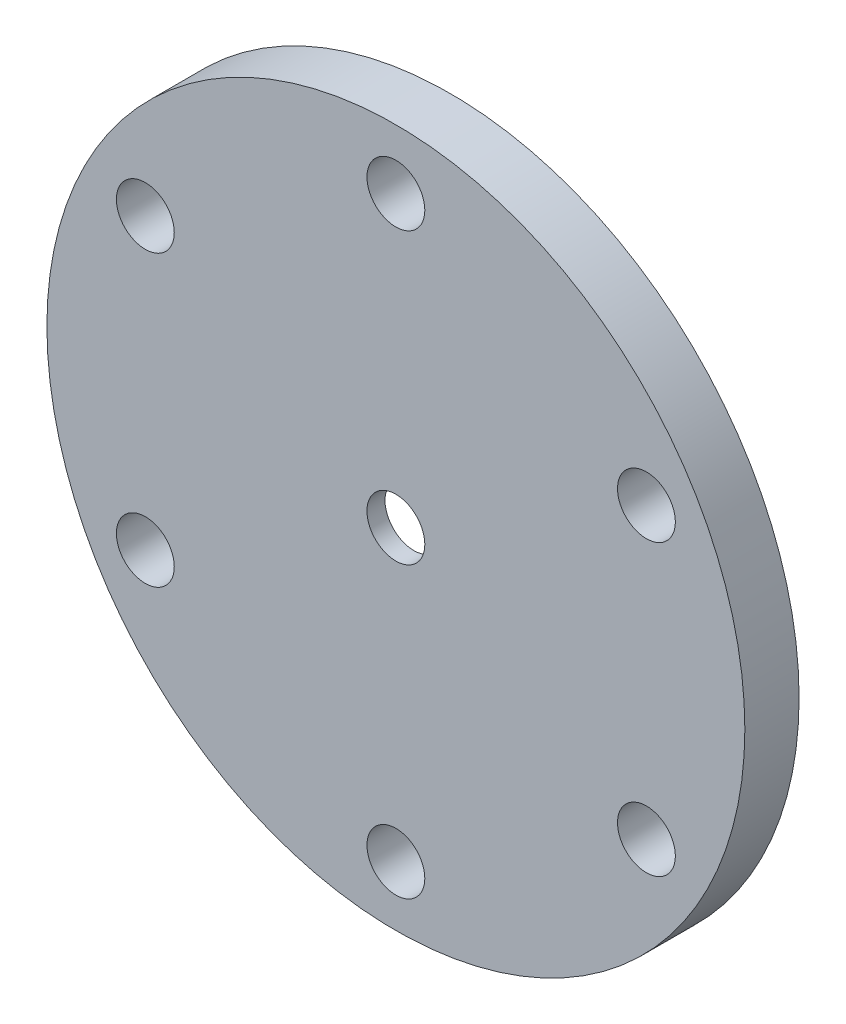
ISO-10303-21;
HEADER;
FILE_DESCRIPTION(('STEP AP214'),'2;1');
FILE_NAME('part.step','',(''),(''),'','','');
FILE_SCHEMA(('AUTOMOTIVE_DESIGN { 1 0 10303 214 1 1 1 1 }'));
ENDSEC;
DATA;
#1=APPLICATION_CONTEXT('core data for automotive mechanical design processes');
#2=APPLICATION_PROTOCOL_DEFINITION('international standard','automotive_design',2000,#1);
#3=PRODUCT_CONTEXT('',#1,'mechanical');
#4=PRODUCT('Part','Part','',(#3));
#5=PRODUCT_RELATED_PRODUCT_CATEGORY('part','',(#4));
#6=PRODUCT_DEFINITION_FORMATION('','',#4);
#7=PRODUCT_DEFINITION_CONTEXT('part definition',#1,'design');
#8=PRODUCT_DEFINITION('design','',#6,#7);
#9=PRODUCT_DEFINITION_SHAPE('','',#8);
#10=(LENGTH_UNIT() NAMED_UNIT(*) SI_UNIT(.MILLI.,.METRE.));
#11=(NAMED_UNIT(*) PLANE_ANGLE_UNIT() SI_UNIT($,.RADIAN.));
#12=(NAMED_UNIT(*) SI_UNIT($,.STERADIAN.) SOLID_ANGLE_UNIT());
#13=UNCERTAINTY_MEASURE_WITH_UNIT(LENGTH_MEASURE(1.E-05),#10,'distance_accuracy_value','');
#14=(GEOMETRIC_REPRESENTATION_CONTEXT(3) GLOBAL_UNCERTAINTY_ASSIGNED_CONTEXT((#13)) GLOBAL_UNIT_ASSIGNED_CONTEXT((#10,
#11,#12)) REPRESENTATION_CONTEXT('',''));
#15=CARTESIAN_POINT('',(0.,0.,0.));
#16=DIRECTION('',(0.,0.,1.));
#17=DIRECTION('',(1.,0.,0.));
#18=AXIS2_PLACEMENT_3D('',#15,#16,#17);
#19=CARTESIAN_POINT('',(0.,0.,1.5));
#20=DIRECTION('',(0.,0.,-1.));
#21=DIRECTION('',(-1.,0.,0.));
#22=AXIS2_PLACEMENT_3D('',#19,#20,#21);
#23=CYLINDRICAL_SURFACE('',#22,1.6);
#24=CARTESIAN_POINT('',(0.,0.,1.5));
#25=DIRECTION('',(0.,0.,1.));
#26=DIRECTION('',(1.,0.,0.));
#27=AXIS2_PLACEMENT_3D('',#24,#25,#26);
#28=CIRCLE('',#27,1.6);
#29=CARTESIAN_POINT('',(1.6,0.,1.5));
#30=VERTEX_POINT('',#29);
#31=EDGE_CURVE('E47',#30,#30,#28,.T.);
#32=ORIENTED_EDGE('',*,*,#31,.T.);
#33=EDGE_LOOP('',(#32));
#34=FACE_BOUND('',#33,.T.);
#35=CARTESIAN_POINT('',(0.,0.,0.5));
#36=DIRECTION('',(0.,0.,-1.));
#37=DIRECTION('',(-1.,0.,0.));
#38=AXIS2_PLACEMENT_3D('',#35,#36,#37);
#39=CIRCLE('',#38,1.6);
#40=CARTESIAN_POINT('',(-1.6,0.,0.5));
#41=VERTEX_POINT('',#40);
#42=EDGE_CURVE('E86',#41,#41,#39,.T.);
#43=ORIENTED_EDGE('',*,*,#42,.T.);
#44=EDGE_LOOP('',(#43));
#45=FACE_BOUND('',#44,.T.);
#46=ADVANCED_FACE('F31',(#34,#45),#23,.F.);
#47=CARTESIAN_POINT('',(0.,0.,1.5));
#48=DIRECTION('',(0.,0.,1.));
#49=DIRECTION('',(1.,0.,0.));
#50=AXIS2_PLACEMENT_3D('',#47,#48,#49);
#51=PLANE('',#50);
#52=CARTESIAN_POINT('',(-13.85640646055,-8.0000000000006,1.5));
#53=DIRECTION('',(0.,0.,1.));
#54=DIRECTION('',(1.,0.,0.));
#55=AXIS2_PLACEMENT_3D('',#52,#53,#54);
#56=CIRCLE('',#55,1.60000000000129);
#57=CARTESIAN_POINT('',(-12.2564064605487,-8.0000000000006,1.5));
#58=VERTEX_POINT('',#57);
#59=EDGE_CURVE('E68',#58,#58,#56,.T.);
#60=ORIENTED_EDGE('',*,*,#59,.F.);
#61=EDGE_LOOP('',(#60));
#62=FACE_BOUND('',#61,.T.);
#63=CARTESIAN_POINT('',(13.856406460552,-7.99999999999941,1.5));
#64=DIRECTION('',(0.,0.,1.));
#65=DIRECTION('',(1.,0.,0.));
#66=AXIS2_PLACEMENT_3D('',#63,#64,#65);
#67=CIRCLE('',#66,1.60000000000088);
#68=CARTESIAN_POINT('',(15.4564064605529,-7.99999999999941,1.5));
#69=VERTEX_POINT('',#68);
#70=EDGE_CURVE('E56',#69,#69,#67,.T.);
#71=ORIENTED_EDGE('',*,*,#70,.F.);
#72=EDGE_LOOP('',(#71));
#73=FACE_BOUND('',#72,.T.);
#74=ORIENTED_EDGE('',*,*,#31,.F.);
#75=EDGE_LOOP('',(#74));
#76=FACE_BOUND('',#75,.T.);
#77=CARTESIAN_POINT('',(0.,0.,1.5));
#78=DIRECTION('',(0.,0.,1.));
#79=DIRECTION('',(1.,0.,0.));
#80=AXIS2_PLACEMENT_3D('',#77,#78,#79);
#81=CIRCLE('',#80,19.3);
#82=CARTESIAN_POINT('',(19.3,0.,1.5));
#83=VERTEX_POINT('',#82);
#84=EDGE_CURVE('E10',#83,#83,#81,.T.);
#85=ORIENTED_EDGE('',*,*,#84,.T.);
#86=EDGE_LOOP('',(#85));
#87=FACE_BOUND('',#86,.T.);
#88=CARTESIAN_POINT('',(0.,16.,1.5));
#89=DIRECTION('',(0.,0.,1.));
#90=DIRECTION('',(1.,0.,0.));
#91=AXIS2_PLACEMENT_3D('',#88,#89,#90);
#92=CIRCLE('',#91,1.6);
#93=CARTESIAN_POINT('',(1.6,16.,1.5));
#94=VERTEX_POINT('',#93);
#95=EDGE_CURVE('E42',#94,#94,#92,.T.);
#96=ORIENTED_EDGE('',*,*,#95,.F.);
#97=EDGE_LOOP('',(#96));
#98=FACE_BOUND('',#97,.T.);
#99=CARTESIAN_POINT('',(13.856406460551,7.99999999999997,1.5));
#100=DIRECTION('',(0.,0.,1.));
#101=DIRECTION('',(1.,0.,0.));
#102=AXIS2_PLACEMENT_3D('',#99,#100,#101);
#103=CIRCLE('',#102,1.6);
#104=CARTESIAN_POINT('',(15.456406460551,7.99999999999997,1.5));
#105=VERTEX_POINT('',#104);
#106=EDGE_CURVE('E52',#105,#105,#103,.T.);
#107=ORIENTED_EDGE('',*,*,#106,.F.);
#108=EDGE_LOOP('',(#107));
#109=FACE_BOUND('',#108,.T.);
#110=CARTESIAN_POINT('',(1.35836374802349E-12,-16.,1.5));
#111=DIRECTION('',(0.,0.,1.));
#112=DIRECTION('',(1.,0.,0.));
#113=AXIS2_PLACEMENT_3D('',#110,#111,#112);
#114=CIRCLE('',#113,1.60000000000141);
#115=CARTESIAN_POINT('',(1.60000000000276,-16.,1.5));
#116=VERTEX_POINT('',#115);
#117=EDGE_CURVE('E62',#116,#116,#114,.T.);
#118=ORIENTED_EDGE('',*,*,#117,.F.);
#119=EDGE_LOOP('',(#118));
#120=FACE_BOUND('',#119,.T.);
#121=CARTESIAN_POINT('',(-13.8564064605509,8.00000000000016,1.5));
#122=DIRECTION('',(0.,0.,1.));
#123=DIRECTION('',(1.,0.,0.));
#124=AXIS2_PLACEMENT_3D('',#121,#122,#123);
#125=CIRCLE('',#124,1.6);
#126=CARTESIAN_POINT('',(-12.2564064605509,8.00000000000016,1.5));
#127=VERTEX_POINT('',#126);
#128=EDGE_CURVE('E74',#127,#127,#125,.T.);
#129=ORIENTED_EDGE('',*,*,#128,.F.);
#130=EDGE_LOOP('',(#129));
#131=FACE_BOUND('',#130,.T.);
#132=ADVANCED_FACE('F109',(#62,#73,#76,#87,#98,#109,#120,#131),#51,.T.);
#133=CARTESIAN_POINT('',(0.,0.,-1.5));
#134=DIRECTION('',(0.,0.,1.));
#135=DIRECTION('',(1.,0.,0.));
#136=AXIS2_PLACEMENT_3D('',#133,#134,#135);
#137=PLANE('',#136);
#138=CARTESIAN_POINT('',(0.,0.,-1.5));
#139=DIRECTION('',(0.,0.,-1.));
#140=DIRECTION('',(-1.,0.,0.));
#141=AXIS2_PLACEMENT_3D('',#138,#139,#140);
#142=CIRCLE('',#141,12.);
#143=CARTESIAN_POINT('',(-12.,0.,-1.5));
#144=VERTEX_POINT('',#143);
#145=EDGE_CURVE('E83',#144,#144,#142,.T.);
#146=ORIENTED_EDGE('',*,*,#145,.F.);
#147=EDGE_LOOP('',(#146));
#148=FACE_BOUND('',#147,.T.);
#149=CARTESIAN_POINT('',(0.,0.,-1.5));
#150=DIRECTION('',(0.,0.,1.));
#151=DIRECTION('',(1.,0.,0.));
#152=AXIS2_PLACEMENT_3D('',#149,#150,#151);
#153=CIRCLE('',#152,19.3);
#154=CARTESIAN_POINT('',(19.3,0.,-1.5));
#155=VERTEX_POINT('',#154);
#156=EDGE_CURVE('E35',#155,#155,#153,.T.);
#157=ORIENTED_EDGE('',*,*,#156,.F.);
#158=EDGE_LOOP('',(#157));
#159=FACE_BOUND('',#158,.T.);
#160=CARTESIAN_POINT('',(0.,16.,-1.5));
#161=DIRECTION('',(0.,0.,1.));
#162=DIRECTION('',(1.,0.,0.));
#163=AXIS2_PLACEMENT_3D('',#160,#161,#162);
#164=CIRCLE('',#163,1.6);
#165=CARTESIAN_POINT('',(1.6,16.,-1.5));
#166=VERTEX_POINT('',#165);
#167=EDGE_CURVE('E44',#166,#166,#164,.T.);
#168=ORIENTED_EDGE('',*,*,#167,.T.);
#169=EDGE_LOOP('',(#168));
#170=FACE_BOUND('',#169,.T.);
#171=CARTESIAN_POINT('',(13.856406460551,7.99999999999997,-1.5));
#172=DIRECTION('',(0.,0.,1.));
#173=DIRECTION('',(1.,0.,0.));
#174=AXIS2_PLACEMENT_3D('',#171,#172,#173);
#175=CIRCLE('',#174,1.6);
#176=CARTESIAN_POINT('',(15.456406460551,7.99999999999997,-1.5));
#177=VERTEX_POINT('',#176);
#178=EDGE_CURVE('E53',#177,#177,#175,.T.);
#179=ORIENTED_EDGE('',*,*,#178,.T.);
#180=EDGE_LOOP('',(#179));
#181=FACE_BOUND('',#180,.T.);
#182=CARTESIAN_POINT('',(13.856406460552,-7.99999999999941,-1.5));
#183=DIRECTION('',(0.,0.,1.));
#184=DIRECTION('',(1.,0.,0.));
#185=AXIS2_PLACEMENT_3D('',#182,#183,#184);
#186=CIRCLE('',#185,1.60000000000088);
#187=CARTESIAN_POINT('',(15.4564064605529,-7.99999999999941,-1.5));
#188=VERTEX_POINT('',#187);
#189=EDGE_CURVE('E59',#188,#188,#186,.T.);
#190=ORIENTED_EDGE('',*,*,#189,.T.);
#191=EDGE_LOOP('',(#190));
#192=FACE_BOUND('',#191,.T.);
#193=CARTESIAN_POINT('',(1.35836374802349E-12,-16.,-1.5));
#194=DIRECTION('',(0.,0.,1.));
#195=DIRECTION('',(1.,0.,0.));
#196=AXIS2_PLACEMENT_3D('',#193,#194,#195);
#197=CIRCLE('',#196,1.60000000000141);
#198=CARTESIAN_POINT('',(1.60000000000276,-16.,-1.5));
#199=VERTEX_POINT('',#198);
#200=EDGE_CURVE('E65',#199,#199,#197,.T.);
#201=ORIENTED_EDGE('',*,*,#200,.T.);
#202=EDGE_LOOP('',(#201));
#203=FACE_BOUND('',#202,.T.);
#204=CARTESIAN_POINT('',(-13.85640646055,-8.0000000000006,-1.5));
#205=DIRECTION('',(0.,0.,1.));
#206=DIRECTION('',(1.,0.,0.));
#207=AXIS2_PLACEMENT_3D('',#204,#205,#206);
#208=CIRCLE('',#207,1.60000000000129);
#209=CARTESIAN_POINT('',(-12.2564064605487,-8.0000000000006,-1.5));
#210=VERTEX_POINT('',#209);
#211=EDGE_CURVE('E71',#210,#210,#208,.T.);
#212=ORIENTED_EDGE('',*,*,#211,.T.);
#213=EDGE_LOOP('',(#212));
#214=FACE_BOUND('',#213,.T.);
#215=CARTESIAN_POINT('',(-13.8564064605509,8.00000000000016,-1.5));
#216=DIRECTION('',(0.,0.,1.));
#217=DIRECTION('',(1.,0.,0.));
#218=AXIS2_PLACEMENT_3D('',#215,#216,#217);
#219=CIRCLE('',#218,1.6);
#220=CARTESIAN_POINT('',(-12.2564064605509,8.00000000000016,-1.5));
#221=VERTEX_POINT('',#220);
#222=EDGE_CURVE('E77',#221,#221,#219,.T.);
#223=ORIENTED_EDGE('',*,*,#222,.T.);
#224=EDGE_LOOP('',(#223));
#225=FACE_BOUND('',#224,.T.);
#226=ADVANCED_FACE('F106',(#148,#159,#170,#181,#192,#203,#214,#225),#137,.F.);
#227=CARTESIAN_POINT('',(0.,0.,1.5));
#228=DIRECTION('',(0.,0.,-1.));
#229=DIRECTION('',(-1.,0.,0.));
#230=AXIS2_PLACEMENT_3D('',#227,#228,#229);
#231=CYLINDRICAL_SURFACE('',#230,19.3);
#232=ORIENTED_EDGE('',*,*,#84,.F.);
#233=EDGE_LOOP('',(#232));
#234=FACE_BOUND('',#233,.T.);
#235=ORIENTED_EDGE('',*,*,#156,.T.);
#236=EDGE_LOOP('',(#235));
#237=FACE_BOUND('',#236,.T.);
#238=ADVANCED_FACE('F33',(#234,#237),#231,.T.);
#239=CARTESIAN_POINT('',(0.,16.,1.5));
#240=DIRECTION('',(0.,0.,-1.));
#241=DIRECTION('',(-1.,0.,0.));
#242=AXIS2_PLACEMENT_3D('',#239,#240,#241);
#243=CYLINDRICAL_SURFACE('',#242,1.6);
#244=ORIENTED_EDGE('',*,*,#95,.T.);
#245=EDGE_LOOP('',(#244));
#246=FACE_BOUND('',#245,.T.);
#247=ORIENTED_EDGE('',*,*,#167,.F.);
#248=EDGE_LOOP('',(#247));
#249=FACE_BOUND('',#248,.T.);
#250=ADVANCED_FACE('F146',(#246,#249),#243,.F.);
#251=CARTESIAN_POINT('',(13.856406460551,7.99999999999997,1.5));
#252=DIRECTION('',(0.,0.,-1.));
#253=DIRECTION('',(-1.,0.,0.));
#254=AXIS2_PLACEMENT_3D('',#251,#252,#253);
#255=CYLINDRICAL_SURFACE('',#254,1.6);
#256=ORIENTED_EDGE('',*,*,#106,.T.);
#257=EDGE_LOOP('',(#256));
#258=FACE_BOUND('',#257,.T.);
#259=ORIENTED_EDGE('',*,*,#178,.F.);
#260=EDGE_LOOP('',(#259));
#261=FACE_BOUND('',#260,.T.);
#262=ADVANCED_FACE('F144',(#258,#261),#255,.F.);
#263=CARTESIAN_POINT('',(13.856406460552,-7.99999999999941,1.5));
#264=DIRECTION('',(0.,0.,-1.));
#265=DIRECTION('',(-1.,0.,0.));
#266=AXIS2_PLACEMENT_3D('',#263,#264,#265);
#267=CYLINDRICAL_SURFACE('',#266,1.60000000000088);
#268=ORIENTED_EDGE('',*,*,#70,.T.);
#269=EDGE_LOOP('',(#268));
#270=FACE_BOUND('',#269,.T.);
#271=ORIENTED_EDGE('',*,*,#189,.F.);
#272=EDGE_LOOP('',(#271));
#273=FACE_BOUND('',#272,.T.);
#274=ADVANCED_FACE('F153',(#270,#273),#267,.F.);
#275=CARTESIAN_POINT('',(1.35836374802349E-12,-16.,1.5));
#276=DIRECTION('',(0.,0.,-1.));
#277=DIRECTION('',(-1.,0.,0.));
#278=AXIS2_PLACEMENT_3D('',#275,#276,#277);
#279=CYLINDRICAL_SURFACE('',#278,1.60000000000141);
#280=ORIENTED_EDGE('',*,*,#117,.T.);
#281=EDGE_LOOP('',(#280));
#282=FACE_BOUND('',#281,.T.);
#283=ORIENTED_EDGE('',*,*,#200,.F.);
#284=EDGE_LOOP('',(#283));
#285=FACE_BOUND('',#284,.T.);
#286=ADVANCED_FACE('F131',(#282,#285),#279,.F.);
#287=CARTESIAN_POINT('',(-13.85640646055,-8.0000000000006,1.5));
#288=DIRECTION('',(0.,0.,-1.));
#289=DIRECTION('',(-1.,0.,0.));
#290=AXIS2_PLACEMENT_3D('',#287,#288,#289);
#291=CYLINDRICAL_SURFACE('',#290,1.60000000000129);
#292=ORIENTED_EDGE('',*,*,#59,.T.);
#293=EDGE_LOOP('',(#292));
#294=FACE_BOUND('',#293,.T.);
#295=ORIENTED_EDGE('',*,*,#211,.F.);
#296=EDGE_LOOP('',(#295));
#297=FACE_BOUND('',#296,.T.);
#298=ADVANCED_FACE('F125',(#294,#297),#291,.F.);
#299=CARTESIAN_POINT('',(-13.8564064605509,8.00000000000016,1.5));
#300=DIRECTION('',(0.,0.,-1.));
#301=DIRECTION('',(-1.,0.,0.));
#302=AXIS2_PLACEMENT_3D('',#299,#300,#301);
#303=CYLINDRICAL_SURFACE('',#302,1.6);
#304=ORIENTED_EDGE('',*,*,#128,.T.);
#305=EDGE_LOOP('',(#304));
#306=FACE_BOUND('',#305,.T.);
#307=ORIENTED_EDGE('',*,*,#222,.F.);
#308=EDGE_LOOP('',(#307));
#309=FACE_BOUND('',#308,.T.);
#310=ADVANCED_FACE('F102',(#306,#309),#303,.F.);
#311=CARTESIAN_POINT('',(0.,0.,0.5));
#312=DIRECTION('',(0.,0.,-1.));
#313=DIRECTION('',(-1.,0.,0.));
#314=AXIS2_PLACEMENT_3D('',#311,#312,#313);
#315=CYLINDRICAL_SURFACE('',#314,12.);
#316=CARTESIAN_POINT('',(0.,0.,0.5));
#317=DIRECTION('',(0.,0.,-1.));
#318=DIRECTION('',(-1.,0.,0.));
#319=AXIS2_PLACEMENT_3D('',#316,#317,#318);
#320=CIRCLE('',#319,12.);
#321=CARTESIAN_POINT('',(-12.,0.,0.5));
#322=VERTEX_POINT('',#321);
#323=EDGE_CURVE('E80',#322,#322,#320,.T.);
#324=ORIENTED_EDGE('',*,*,#323,.F.);
#325=EDGE_LOOP('',(#324));
#326=FACE_BOUND('',#325,.T.);
#327=ORIENTED_EDGE('',*,*,#145,.T.);
#328=EDGE_LOOP('',(#327));
#329=FACE_BOUND('',#328,.T.);
#330=ADVANCED_FACE('F96',(#326,#329),#315,.F.);
#331=CARTESIAN_POINT('',(0.,0.,0.5));
#332=DIRECTION('',(0.,0.,-1.));
#333=DIRECTION('',(-1.,0.,0.));
#334=AXIS2_PLACEMENT_3D('',#331,#332,#333);
#335=PLANE('',#334);
#336=ORIENTED_EDGE('',*,*,#42,.F.);
#337=EDGE_LOOP('',(#336));
#338=FACE_BOUND('',#337,.T.);
#339=ORIENTED_EDGE('',*,*,#323,.T.);
#340=EDGE_LOOP('',(#339));
#341=FACE_BOUND('',#340,.T.);
#342=ADVANCED_FACE('F93',(#338,#341),#335,.T.);
#343=CLOSED_SHELL('',(#46,#132,#226,#238,#250,#262,#274,#286,#298,#310,#330,#342));
#344=MANIFOLD_SOLID_BREP('B2',#343);
#345=ADVANCED_BREP_SHAPE_REPRESENTATION('',(#18,#344),#14);
#346=SHAPE_DEFINITION_REPRESENTATION(#9,#345);
ENDSEC;
END-ISO-10303-21;
